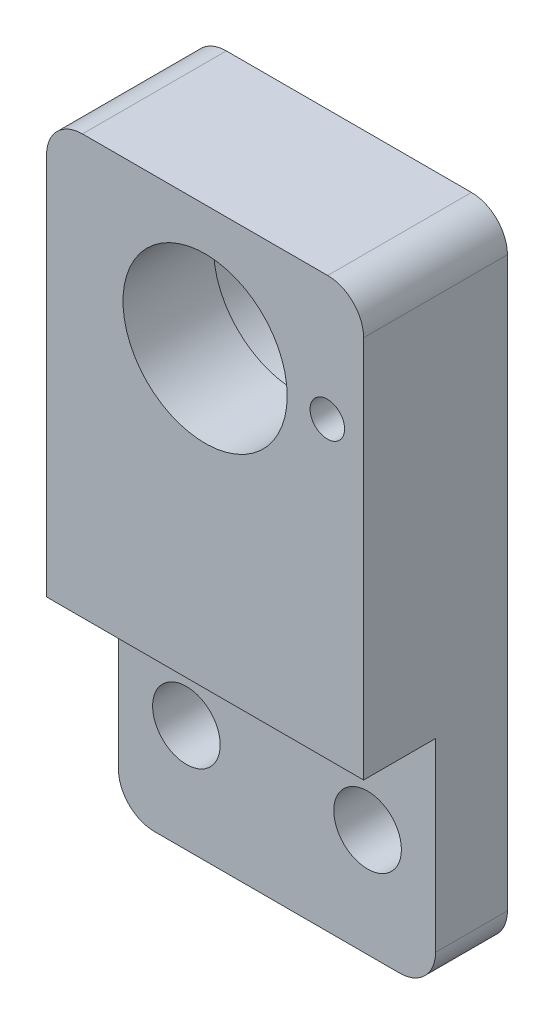
ISO-10303-21;
HEADER;
FILE_DESCRIPTION(('STEP AP214'),'2;1');
FILE_NAME('part.step','',(''),(''),'','','');
FILE_SCHEMA(('AUTOMOTIVE_DESIGN { 1 0 10303 214 1 1 1 1 }'));
ENDSEC;
DATA;
#1=APPLICATION_CONTEXT('core data for automotive mechanical design processes');
#2=APPLICATION_PROTOCOL_DEFINITION('international standard','automotive_design',2000,#1);
#3=PRODUCT_CONTEXT('',#1,'mechanical');
#4=PRODUCT('Part','Part','',(#3));
#5=PRODUCT_RELATED_PRODUCT_CATEGORY('part','',(#4));
#6=PRODUCT_DEFINITION_FORMATION('','',#4);
#7=PRODUCT_DEFINITION_CONTEXT('part definition',#1,'design');
#8=PRODUCT_DEFINITION('design','',#6,#7);
#9=PRODUCT_DEFINITION_SHAPE('','',#8);
#10=(LENGTH_UNIT() NAMED_UNIT(*) SI_UNIT(.MILLI.,.METRE.));
#11=(NAMED_UNIT(*) PLANE_ANGLE_UNIT() SI_UNIT($,.RADIAN.));
#12=(NAMED_UNIT(*) SI_UNIT($,.STERADIAN.) SOLID_ANGLE_UNIT());
#13=UNCERTAINTY_MEASURE_WITH_UNIT(LENGTH_MEASURE(1.E-05),#10,'distance_accuracy_value','');
#14=(GEOMETRIC_REPRESENTATION_CONTEXT(3) GLOBAL_UNCERTAINTY_ASSIGNED_CONTEXT((#13)) GLOBAL_UNIT_ASSIGNED_CONTEXT((#10,
#11,#12)) REPRESENTATION_CONTEXT('',''));
#15=CARTESIAN_POINT('',(0.,0.,0.));
#16=DIRECTION('',(0.,0.,1.));
#17=DIRECTION('',(1.,0.,0.));
#18=AXIS2_PLACEMENT_3D('',#15,#16,#17);
#19=CARTESIAN_POINT('',(125.3679604269,43.2406230543916,12.7));
#20=DIRECTION('',(-1.,0.,0.));
#21=DIRECTION('',(0.,0.,1.));
#22=AXIS2_PLACEMENT_3D('',#19,#20,#21);
#23=PLANE('',#22);
#24=DIRECTION('',(0.,1.,0.));
#25=VECTOR('',#24,1.);
#26=CARTESIAN_POINT('',(125.3679604269,43.2406230543916,6.35));
#27=LINE('',#26,#25);
#28=CARTESIAN_POINT('',(125.3679604269,67.36020405758,6.35));
#29=VERTEX_POINT('',#28);
#30=CARTESIAN_POINT('',(125.3679604269,83.71528405754,6.35));
#31=VERTEX_POINT('',#30);
#32=EDGE_CURVE('E230',#29,#31,#27,.T.);
#33=ORIENTED_EDGE('',*,*,#32,.T.);
#34=DIRECTION('',(0.,0.,1.));
#35=VECTOR('',#34,1.);
#36=CARTESIAN_POINT('',(125.3679604269,83.71528405754,6.35));
#37=LINE('',#36,#35);
#38=CARTESIAN_POINT('',(125.3679604269,83.71528405754,12.7));
#39=VERTEX_POINT('',#38);
#40=EDGE_CURVE('E219',#31,#39,#37,.T.);
#41=ORIENTED_EDGE('',*,*,#40,.T.);
#42=DIRECTION('',(0.,1.,0.));
#43=VECTOR('',#42,1.);
#44=CARTESIAN_POINT('',(125.3679604269,43.2406230543916,12.7));
#45=LINE('',#44,#43);
#46=CARTESIAN_POINT('',(125.3679604269,117.5402840579,12.7));
#47=VERTEX_POINT('',#46);
#48=EDGE_CURVE('E160',#39,#47,#45,.T.);
#49=ORIENTED_EDGE('',*,*,#48,.T.);
#50=DIRECTION('',(0.,0.,-1.));
#51=VECTOR('',#50,1.);
#52=CARTESIAN_POINT('',(125.3679604269,117.5402840579,12.7));
#53=LINE('',#52,#51);
#54=CARTESIAN_POINT('',(125.3679604269,117.5402840579,0.));
#55=VERTEX_POINT('',#54);
#56=EDGE_CURVE('E39',#47,#55,#53,.T.);
#57=ORIENTED_EDGE('',*,*,#56,.T.);
#58=DIRECTION('',(0.,1.,0.));
#59=VECTOR('',#58,1.);
#60=CARTESIAN_POINT('',(125.3679604269,43.2406230543916,0.));
#61=LINE('',#60,#59);
#62=CARTESIAN_POINT('',(125.3679604269,67.36020405758,0.));
#63=VERTEX_POINT('',#62);
#64=EDGE_CURVE('E157',#63,#55,#61,.T.);
#65=ORIENTED_EDGE('',*,*,#64,.F.);
#66=DIRECTION('',(0.,0.,-1.));
#67=VECTOR('',#66,1.);
#68=CARTESIAN_POINT('',(125.3679604269,67.36020405758,12.7));
#69=LINE('',#68,#67);
#70=EDGE_CURVE('E145',#29,#63,#69,.T.);
#71=ORIENTED_EDGE('',*,*,#70,.F.);
#72=EDGE_LOOP('',(#33,#41,#49,#57,#65,#71));
#73=FACE_BOUND('',#72,.T.);
#74=ADVANCED_FACE('F31',(#73),#23,.T.);
#75=CARTESIAN_POINT('',(128.5429604269,67.36020405758,12.7));
#76=DIRECTION('',(0.,0.,-1.));
#77=DIRECTION('',(-1.,0.,0.));
#78=AXIS2_PLACEMENT_3D('',#75,#76,#77);
#79=CYLINDRICAL_SURFACE('',#78,3.17500000000001);
#80=CARTESIAN_POINT('',(128.5429604269,67.36020405758,6.35));
#81=DIRECTION('',(0.,0.,1.));
#82=DIRECTION('',(1.,0.,0.));
#83=AXIS2_PLACEMENT_3D('',#80,#81,#82);
#84=CIRCLE('',#83,3.17500000000001);
#85=CARTESIAN_POINT('',(128.5429604269,64.18520405758,6.35));
#86=VERTEX_POINT('',#85);
#87=EDGE_CURVE('E124',#29,#86,#84,.T.);
#88=ORIENTED_EDGE('',*,*,#87,.F.);
#89=ORIENTED_EDGE('',*,*,#70,.T.);
#90=CARTESIAN_POINT('',(128.5429604269,67.36020405758,0.));
#91=DIRECTION('',(0.,0.,1.));
#92=DIRECTION('',(1.,0.,0.));
#93=AXIS2_PLACEMENT_3D('',#90,#91,#92);
#94=CIRCLE('',#93,3.17500000000001);
#95=CARTESIAN_POINT('',(128.5429604269,64.18520405758,0.));
#96=VERTEX_POINT('',#95);
#97=EDGE_CURVE('E173',#63,#96,#94,.T.);
#98=ORIENTED_EDGE('',*,*,#97,.T.);
#99=DIRECTION('',(0.,0.,-1.));
#100=VECTOR('',#99,1.);
#101=CARTESIAN_POINT('',(128.5429604269,64.18520405758,12.7));
#102=LINE('',#101,#100);
#103=EDGE_CURVE('E143',#86,#96,#102,.T.);
#104=ORIENTED_EDGE('',*,*,#103,.F.);
#105=EDGE_LOOP('',(#88,#89,#98,#104));
#106=FACE_BOUND('',#105,.T.);
#107=ADVANCED_FACE('F264',(#106),#79,.T.);
#108=CARTESIAN_POINT('',(139.36796042659,64.18520405758,12.7));
#109=DIRECTION('',(0.,1.,0.));
#110=DIRECTION('',(0.,0.,1.));
#111=AXIS2_PLACEMENT_3D('',#108,#109,#110);
#112=PLANE('',#111);
#113=DIRECTION('',(1.,0.,0.));
#114=VECTOR('',#113,1.);
#115=CARTESIAN_POINT('',(139.36796042659,64.18520405758,6.35));
#116=LINE('',#115,#114);
#117=CARTESIAN_POINT('',(150.19296042628,64.18520405758,6.35));
#118=VERTEX_POINT('',#117);
#119=EDGE_CURVE('E117',#86,#118,#116,.T.);
#120=ORIENTED_EDGE('',*,*,#119,.F.);
#121=ORIENTED_EDGE('',*,*,#103,.T.);
#122=DIRECTION('',(1.,0.,0.));
#123=VECTOR('',#122,1.);
#124=CARTESIAN_POINT('',(139.36796042659,64.18520405758,0.));
#125=LINE('',#124,#123);
#126=CARTESIAN_POINT('',(150.19296042628,64.18520405758,0.));
#127=VERTEX_POINT('',#126);
#128=EDGE_CURVE('E141',#96,#127,#125,.T.);
#129=ORIENTED_EDGE('',*,*,#128,.T.);
#130=DIRECTION('',(0.,0.,-1.));
#131=VECTOR('',#130,1.);
#132=CARTESIAN_POINT('',(150.19296042628,64.18520405758,12.7));
#133=LINE('',#132,#131);
#134=EDGE_CURVE('E134',#118,#127,#133,.T.);
#135=ORIENTED_EDGE('',*,*,#134,.F.);
#136=EDGE_LOOP('',(#120,#121,#129,#135));
#137=FACE_BOUND('',#136,.T.);
#138=ADVANCED_FACE('F139',(#137),#112,.F.);
#139=CARTESIAN_POINT('',(150.19296042628,67.36020405758,12.7));
#140=DIRECTION('',(0.,0.,-1.));
#141=DIRECTION('',(-1.,0.,0.));
#142=AXIS2_PLACEMENT_3D('',#139,#140,#141);
#143=CYLINDRICAL_SURFACE('',#142,3.17500000000001);
#144=CARTESIAN_POINT('',(150.19296042628,67.36020405758,6.35));
#145=DIRECTION('',(0.,0.,1.));
#146=DIRECTION('',(1.,0.,0.));
#147=AXIS2_PLACEMENT_3D('',#144,#145,#146);
#148=CIRCLE('',#147,3.17500000000001);
#149=CARTESIAN_POINT('',(153.36796042628,67.36020405758,6.35));
#150=VERTEX_POINT('',#149);
#151=EDGE_CURVE('E121',#118,#150,#148,.T.);
#152=ORIENTED_EDGE('',*,*,#151,.F.);
#153=ORIENTED_EDGE('',*,*,#134,.T.);
#154=CARTESIAN_POINT('',(150.19296042628,67.36020405758,0.));
#155=DIRECTION('',(0.,0.,1.));
#156=DIRECTION('',(1.,0.,0.));
#157=AXIS2_PLACEMENT_3D('',#154,#155,#156);
#158=CIRCLE('',#157,3.17500000000001);
#159=CARTESIAN_POINT('',(153.36796042628,67.36020405758,0.));
#160=VERTEX_POINT('',#159);
#161=EDGE_CURVE('E179',#127,#160,#158,.T.);
#162=ORIENTED_EDGE('',*,*,#161,.T.);
#163=DIRECTION('',(0.,0.,-1.));
#164=VECTOR('',#163,1.);
#165=CARTESIAN_POINT('',(153.36796042628,67.36020405758,12.7));
#166=LINE('',#165,#164);
#167=EDGE_CURVE('E136',#150,#160,#166,.T.);
#168=ORIENTED_EDGE('',*,*,#167,.F.);
#169=EDGE_LOOP('',(#152,#153,#162,#168));
#170=FACE_BOUND('',#169,.T.);
#171=ADVANCED_FACE('F132',(#170),#143,.T.);
#172=CARTESIAN_POINT('',(153.36796042628,43.2406230543916,12.7));
#173=DIRECTION('',(-1.,0.,0.));
#174=DIRECTION('',(0.,0.,1.));
#175=AXIS2_PLACEMENT_3D('',#172,#173,#174);
#176=PLANE('',#175);
#177=DIRECTION('',(0.,0.,1.));
#178=VECTOR('',#177,1.);
#179=CARTESIAN_POINT('',(153.36796042628,83.71528405754,6.35));
#180=LINE('',#179,#178);
#181=CARTESIAN_POINT('',(153.36796042628,83.71528405754,6.35));
#182=VERTEX_POINT('',#181);
#183=CARTESIAN_POINT('',(153.36796042628,83.71528405754,12.7));
#184=VERTEX_POINT('',#183);
#185=EDGE_CURVE('E46',#182,#184,#180,.T.);
#186=ORIENTED_EDGE('',*,*,#185,.F.);
#187=DIRECTION('',(0.,1.,0.));
#188=VECTOR('',#187,1.);
#189=CARTESIAN_POINT('',(153.36796042628,43.2406230543916,6.35));
#190=LINE('',#189,#188);
#191=EDGE_CURVE('E137',#150,#182,#190,.T.);
#192=ORIENTED_EDGE('',*,*,#191,.F.);
#193=ORIENTED_EDGE('',*,*,#167,.T.);
#194=DIRECTION('',(0.,1.,0.));
#195=VECTOR('',#194,1.);
#196=CARTESIAN_POINT('',(153.36796042628,43.2406230543916,0.));
#197=LINE('',#196,#195);
#198=CARTESIAN_POINT('',(153.36796042628,117.5402840579,0.));
#199=VERTEX_POINT('',#198);
#200=EDGE_CURVE('E181',#160,#199,#197,.T.);
#201=ORIENTED_EDGE('',*,*,#200,.T.);
#202=DIRECTION('',(0.,0.,-1.));
#203=VECTOR('',#202,1.);
#204=CARTESIAN_POINT('',(153.36796042628,117.5402840579,12.7));
#205=LINE('',#204,#203);
#206=CARTESIAN_POINT('',(153.36796042628,117.5402840579,12.7));
#207=VERTEX_POINT('',#206);
#208=EDGE_CURVE('E147',#207,#199,#205,.T.);
#209=ORIENTED_EDGE('',*,*,#208,.F.);
#210=DIRECTION('',(0.,1.,0.));
#211=VECTOR('',#210,1.);
#212=CARTESIAN_POINT('',(153.36796042628,43.2406230543916,12.7));
#213=LINE('',#212,#211);
#214=EDGE_CURVE('E207',#184,#207,#213,.T.);
#215=ORIENTED_EDGE('',*,*,#214,.F.);
#216=EDGE_LOOP('',(#186,#192,#193,#201,#209,#215));
#217=FACE_BOUND('',#216,.T.);
#218=ADVANCED_FACE('F250',(#217),#176,.F.);
#219=CARTESIAN_POINT('',(131.36796042586,73.71528405758,12.7));
#220=DIRECTION('',(0.,0.,-1.));
#221=DIRECTION('',(-1.,0.,0.));
#222=AXIS2_PLACEMENT_3D('',#219,#220,#221);
#223=CYLINDRICAL_SURFACE('',#222,2.9845);
#224=CARTESIAN_POINT('',(131.36796042586,73.71528405758,0.));
#225=DIRECTION('',(0.,0.,1.));
#226=DIRECTION('',(1.,0.,0.));
#227=AXIS2_PLACEMENT_3D('',#224,#225,#226);
#228=CIRCLE('',#227,2.9845);
#229=CARTESIAN_POINT('',(134.35246042586,73.71528405758,0.));
#230=VERTEX_POINT('',#229);
#231=EDGE_CURVE('E187',#230,#230,#228,.T.);
#232=ORIENTED_EDGE('',*,*,#231,.F.);
#233=EDGE_LOOP('',(#232));
#234=FACE_BOUND('',#233,.T.);
#235=CARTESIAN_POINT('',(131.36796042586,73.71528405758,6.35));
#236=DIRECTION('',(0.,0.,1.));
#237=DIRECTION('',(1.,0.,0.));
#238=AXIS2_PLACEMENT_3D('',#235,#236,#237);
#239=CIRCLE('',#238,2.9845);
#240=CARTESIAN_POINT('',(134.35246042586,73.71528405758,6.35));
#241=VERTEX_POINT('',#240);
#242=EDGE_CURVE('E128',#241,#241,#239,.T.);
#243=ORIENTED_EDGE('',*,*,#242,.T.);
#244=EDGE_LOOP('',(#243));
#245=FACE_BOUND('',#244,.T.);
#246=ADVANCED_FACE('F248',(#234,#245),#223,.F.);
#247=CARTESIAN_POINT('',(147.36796042732,73.71528405758,12.7));
#248=DIRECTION('',(0.,0.,-1.));
#249=DIRECTION('',(-1.,0.,0.));
#250=AXIS2_PLACEMENT_3D('',#247,#248,#249);
#251=CYLINDRICAL_SURFACE('',#250,2.9845);
#252=CARTESIAN_POINT('',(147.36796042732,73.71528405758,0.));
#253=DIRECTION('',(0.,0.,1.));
#254=DIRECTION('',(1.,0.,0.));
#255=AXIS2_PLACEMENT_3D('',#252,#253,#254);
#256=CIRCLE('',#255,2.9845);
#257=CARTESIAN_POINT('',(150.35246042732,73.71528405758,0.));
#258=VERTEX_POINT('',#257);
#259=EDGE_CURVE('E184',#258,#258,#256,.T.);
#260=ORIENTED_EDGE('',*,*,#259,.F.);
#261=EDGE_LOOP('',(#260));
#262=FACE_BOUND('',#261,.T.);
#263=CARTESIAN_POINT('',(147.36796042732,73.71528405758,6.35));
#264=DIRECTION('',(0.,0.,1.));
#265=DIRECTION('',(1.,0.,0.));
#266=AXIS2_PLACEMENT_3D('',#263,#264,#265);
#267=CIRCLE('',#266,2.9845);
#268=CARTESIAN_POINT('',(150.35246042732,73.71528405758,6.35));
#269=VERTEX_POINT('',#268);
#270=EDGE_CURVE('E228',#269,#269,#267,.T.);
#271=ORIENTED_EDGE('',*,*,#270,.T.);
#272=EDGE_LOOP('',(#271));
#273=FACE_BOUND('',#272,.T.);
#274=ADVANCED_FACE('F240',(#262,#273),#251,.F.);
#275=CARTESIAN_POINT('',(139.36796042659,43.2406230543916,12.7));
#276=DIRECTION('',(0.,0.,1.));
#277=DIRECTION('',(1.,0.,0.));
#278=AXIS2_PLACEMENT_3D('',#275,#276,#277);
#279=PLANE('',#278);
#280=CARTESIAN_POINT('',(139.36796042786,109.71528405896,12.7));
#281=DIRECTION('',(0.,0.,1.));
#282=DIRECTION('',(1.,0.,0.));
#283=AXIS2_PLACEMENT_3D('',#280,#281,#282);
#284=CIRCLE('',#283,7.25000000085998);
#285=CARTESIAN_POINT('',(146.61796042872,109.71528405896,12.7));
#286=VERTEX_POINT('',#285);
#287=EDGE_CURVE('E192',#286,#286,#284,.T.);
#288=ORIENTED_EDGE('',*,*,#287,.F.);
#289=EDGE_LOOP('',(#288));
#290=FACE_BOUND('',#289,.T.);
#291=CARTESIAN_POINT('',(150.16296042786,109.71528405896,12.7));
#292=DIRECTION('',(0.,0.,1.));
#293=DIRECTION('',(1.,0.,0.));
#294=AXIS2_PLACEMENT_3D('',#291,#292,#293);
#295=CIRCLE('',#294,1.524);
#296=CARTESIAN_POINT('',(151.68696042786,109.71528405896,12.7));
#297=VERTEX_POINT('',#296);
#298=EDGE_CURVE('E190',#297,#297,#295,.T.);
#299=ORIENTED_EDGE('',*,*,#298,.F.);
#300=EDGE_LOOP('',(#299));
#301=FACE_BOUND('',#300,.T.);
#302=ORIENTED_EDGE('',*,*,#48,.F.);
#303=DIRECTION('',(1.,0.,0.));
#304=VECTOR('',#303,1.);
#305=CARTESIAN_POINT('',(139.36796042659,83.71528405754,12.7));
#306=LINE('',#305,#304);
#307=EDGE_CURVE('E226',#39,#184,#306,.T.);
#308=ORIENTED_EDGE('',*,*,#307,.T.);
#309=ORIENTED_EDGE('',*,*,#214,.T.);
#310=CARTESIAN_POINT('',(150.19296042628,117.5402840579,12.7));
#311=DIRECTION('',(0.,0.,1.));
#312=DIRECTION('',(1.,0.,0.));
#313=AXIS2_PLACEMENT_3D('',#310,#311,#312);
#314=CIRCLE('',#313,3.175);
#315=CARTESIAN_POINT('',(150.19296042628,120.7152840579,12.7));
#316=VERTEX_POINT('',#315);
#317=EDGE_CURVE('E55',#207,#316,#314,.T.);
#318=ORIENTED_EDGE('',*,*,#317,.T.);
#319=DIRECTION('',(-1.,0.,0.));
#320=VECTOR('',#319,1.);
#321=CARTESIAN_POINT('',(139.36796042659,120.7152840579,12.7));
#322=LINE('',#321,#320);
#323=CARTESIAN_POINT('',(128.5429604269,120.7152840579,12.7));
#324=VERTEX_POINT('',#323);
#325=EDGE_CURVE('E211',#316,#324,#322,.T.);
#326=ORIENTED_EDGE('',*,*,#325,.T.);
#327=CARTESIAN_POINT('',(128.5429604269,117.5402840579,12.7));
#328=DIRECTION('',(0.,0.,1.));
#329=DIRECTION('',(1.,0.,0.));
#330=AXIS2_PLACEMENT_3D('',#327,#328,#329);
#331=CIRCLE('',#330,3.175);
#332=EDGE_CURVE('E95',#324,#47,#331,.T.);
#333=ORIENTED_EDGE('',*,*,#332,.T.);
#334=EDGE_LOOP('',(#302,#308,#309,#318,#326,#333));
#335=FACE_BOUND('',#334,.T.);
#336=ADVANCED_FACE('F257',(#290,#301,#335),#279,.T.);
#337=CARTESIAN_POINT('',(139.36796042659,43.2406230543916,0.));
#338=DIRECTION('',(0.,0.,1.));
#339=DIRECTION('',(1.,0.,0.));
#340=AXIS2_PLACEMENT_3D('',#337,#338,#339);
#341=PLANE('',#340);
#342=ORIENTED_EDGE('',*,*,#231,.T.);
#343=EDGE_LOOP('',(#342));
#344=FACE_BOUND('',#343,.T.);
#345=ORIENTED_EDGE('',*,*,#259,.T.);
#346=EDGE_LOOP('',(#345));
#347=FACE_BOUND('',#346,.T.);
#348=DIRECTION('',(-1.,0.,0.));
#349=VECTOR('',#348,1.);
#350=CARTESIAN_POINT('',(139.36796042659,120.7152840579,0.));
#351=LINE('',#350,#349);
#352=CARTESIAN_POINT('',(150.19296042628,120.7152840579,0.));
#353=VERTEX_POINT('',#352);
#354=CARTESIAN_POINT('',(128.5429604269,120.7152840579,0.));
#355=VERTEX_POINT('',#354);
#356=EDGE_CURVE('E167',#353,#355,#351,.T.);
#357=ORIENTED_EDGE('',*,*,#356,.F.);
#358=CARTESIAN_POINT('',(150.19296042628,117.5402840579,0.));
#359=DIRECTION('',(0.,0.,1.));
#360=DIRECTION('',(1.,0.,0.));
#361=AXIS2_PLACEMENT_3D('',#358,#359,#360);
#362=CIRCLE('',#361,3.175);
#363=EDGE_CURVE('E88',#199,#353,#362,.T.);
#364=ORIENTED_EDGE('',*,*,#363,.F.);
#365=ORIENTED_EDGE('',*,*,#200,.F.);
#366=ORIENTED_EDGE('',*,*,#161,.F.);
#367=ORIENTED_EDGE('',*,*,#128,.F.);
#368=ORIENTED_EDGE('',*,*,#97,.F.);
#369=ORIENTED_EDGE('',*,*,#64,.T.);
#370=CARTESIAN_POINT('',(128.5429604269,117.5402840579,0.));
#371=DIRECTION('',(0.,0.,1.));
#372=DIRECTION('',(1.,0.,0.));
#373=AXIS2_PLACEMENT_3D('',#370,#371,#372);
#374=CIRCLE('',#373,3.175);
#375=EDGE_CURVE('E161',#355,#55,#374,.T.);
#376=ORIENTED_EDGE('',*,*,#375,.F.);
#377=EDGE_LOOP('',(#357,#364,#365,#366,#367,#368,#369,#376));
#378=FACE_BOUND('',#377,.T.);
#379=CARTESIAN_POINT('',(150.16296042786,109.71528405896,0.));
#380=DIRECTION('',(0.,0.,1.));
#381=DIRECTION('',(1.,0.,0.));
#382=AXIS2_PLACEMENT_3D('',#379,#380,#381);
#383=CIRCLE('',#382,1.524);
#384=CARTESIAN_POINT('',(151.68696042786,109.71528405896,0.));
#385=VERTEX_POINT('',#384);
#386=EDGE_CURVE('E199',#385,#385,#383,.T.);
#387=ORIENTED_EDGE('',*,*,#386,.T.);
#388=EDGE_LOOP('',(#387));
#389=FACE_BOUND('',#388,.T.);
#390=CARTESIAN_POINT('',(139.36796042786,109.71528405896,0.));
#391=DIRECTION('',(0.,0.,1.));
#392=DIRECTION('',(1.,0.,0.));
#393=AXIS2_PLACEMENT_3D('',#390,#391,#392);
#394=CIRCLE('',#393,7.95019999999999);
#395=CARTESIAN_POINT('',(147.31816042786,109.71528405896,0.));
#396=VERTEX_POINT('',#395);
#397=EDGE_CURVE('E215',#396,#396,#394,.T.);
#398=ORIENTED_EDGE('',*,*,#397,.T.);
#399=EDGE_LOOP('',(#398));
#400=FACE_BOUND('',#399,.T.);
#401=ADVANCED_FACE('F170',(#344,#347,#378,#389,#400),#341,.F.);
#402=CARTESIAN_POINT('',(139.36796042659,120.7152840579,12.7));
#403=DIRECTION('',(0.,-1.,0.));
#404=DIRECTION('',(0.,0.,-1.));
#405=AXIS2_PLACEMENT_3D('',#402,#403,#404);
#406=PLANE('',#405);
#407=ORIENTED_EDGE('',*,*,#356,.T.);
#408=DIRECTION('',(0.,0.,-1.));
#409=VECTOR('',#408,1.);
#410=CARTESIAN_POINT('',(128.5429604269,120.7152840579,12.7));
#411=LINE('',#410,#409);
#412=EDGE_CURVE('E11',#324,#355,#411,.T.);
#413=ORIENTED_EDGE('',*,*,#412,.F.);
#414=ORIENTED_EDGE('',*,*,#325,.F.);
#415=DIRECTION('',(0.,0.,-1.));
#416=VECTOR('',#415,1.);
#417=CARTESIAN_POINT('',(150.19296042628,120.7152840579,12.7));
#418=LINE('',#417,#416);
#419=EDGE_CURVE('E191',#316,#353,#418,.T.);
#420=ORIENTED_EDGE('',*,*,#419,.T.);
#421=EDGE_LOOP('',(#407,#413,#414,#420));
#422=FACE_BOUND('',#421,.T.);
#423=ADVANCED_FACE('F274',(#422),#406,.F.);
#424=CARTESIAN_POINT('',(128.5429604269,117.5402840579,12.7));
#425=DIRECTION('',(0.,0.,-1.));
#426=DIRECTION('',(-1.,0.,0.));
#427=AXIS2_PLACEMENT_3D('',#424,#425,#426);
#428=CYLINDRICAL_SURFACE('',#427,3.175);
#429=ORIENTED_EDGE('',*,*,#375,.T.);
#430=ORIENTED_EDGE('',*,*,#56,.F.);
#431=ORIENTED_EDGE('',*,*,#332,.F.);
#432=ORIENTED_EDGE('',*,*,#412,.T.);
#433=EDGE_LOOP('',(#429,#430,#431,#432));
#434=FACE_BOUND('',#433,.T.);
#435=ADVANCED_FACE('F162',(#434),#428,.T.);
#436=CARTESIAN_POINT('',(150.19296042628,117.5402840579,12.7));
#437=DIRECTION('',(0.,0.,-1.));
#438=DIRECTION('',(-1.,0.,0.));
#439=AXIS2_PLACEMENT_3D('',#436,#437,#438);
#440=CYLINDRICAL_SURFACE('',#439,3.175);
#441=ORIENTED_EDGE('',*,*,#363,.T.);
#442=ORIENTED_EDGE('',*,*,#419,.F.);
#443=ORIENTED_EDGE('',*,*,#317,.F.);
#444=ORIENTED_EDGE('',*,*,#208,.T.);
#445=EDGE_LOOP('',(#441,#442,#443,#444));
#446=FACE_BOUND('',#445,.T.);
#447=ADVANCED_FACE('F194',(#446),#440,.T.);
#448=CARTESIAN_POINT('',(150.16296042786,109.71528405896,12.7));
#449=DIRECTION('',(0.,0.,-1.));
#450=DIRECTION('',(-1.,0.,0.));
#451=AXIS2_PLACEMENT_3D('',#448,#449,#450);
#452=CYLINDRICAL_SURFACE('',#451,1.524);
#453=ORIENTED_EDGE('',*,*,#298,.T.);
#454=EDGE_LOOP('',(#453));
#455=FACE_BOUND('',#454,.T.);
#456=ORIENTED_EDGE('',*,*,#386,.F.);
#457=EDGE_LOOP('',(#456));
#458=FACE_BOUND('',#457,.T.);
#459=ADVANCED_FACE('F33',(#455,#458),#452,.F.);
#460=CARTESIAN_POINT('',(139.36796042786,109.71528405896,12.7));
#461=DIRECTION('',(0.,0.,-1.));
#462=DIRECTION('',(-1.,0.,0.));
#463=AXIS2_PLACEMENT_3D('',#460,#461,#462);
#464=CYLINDRICAL_SURFACE('',#463,7.25000000085998);
#465=CARTESIAN_POINT('',(139.36796042786,109.71528405896,4.699));
#466=DIRECTION('',(0.,0.,1.));
#467=DIRECTION('',(1.,0.,0.));
#468=AXIS2_PLACEMENT_3D('',#465,#466,#467);
#469=CIRCLE('',#468,7.25000000085998);
#470=CARTESIAN_POINT('',(146.61796042872,109.71528405896,4.699));
#471=VERTEX_POINT('',#470);
#472=EDGE_CURVE('E218',#471,#471,#469,.T.);
#473=ORIENTED_EDGE('',*,*,#472,.F.);
#474=EDGE_LOOP('',(#473));
#475=FACE_BOUND('',#474,.T.);
#476=ORIENTED_EDGE('',*,*,#287,.T.);
#477=EDGE_LOOP('',(#476));
#478=FACE_BOUND('',#477,.T.);
#479=ADVANCED_FACE('F288',(#475,#478),#464,.F.);
#480=CARTESIAN_POINT('',(139.36796042786,109.71528405896,4.699));
#481=DIRECTION('',(0.,0.,-1.));
#482=DIRECTION('',(-1.,0.,0.));
#483=AXIS2_PLACEMENT_3D('',#480,#481,#482);
#484=CYLINDRICAL_SURFACE('',#483,7.95019999999999);
#485=CARTESIAN_POINT('',(139.36796042786,109.71528405896,4.699));
#486=DIRECTION('',(0.,0.,1.));
#487=DIRECTION('',(1.,0.,0.));
#488=AXIS2_PLACEMENT_3D('',#485,#486,#487);
#489=CIRCLE('',#488,7.95019999999999);
#490=CARTESIAN_POINT('',(147.31816042786,109.71528405896,4.699));
#491=VERTEX_POINT('',#490);
#492=EDGE_CURVE('E201',#491,#491,#489,.T.);
#493=ORIENTED_EDGE('',*,*,#492,.T.);
#494=EDGE_LOOP('',(#493));
#495=FACE_BOUND('',#494,.T.);
#496=ORIENTED_EDGE('',*,*,#397,.F.);
#497=EDGE_LOOP('',(#496));
#498=FACE_BOUND('',#497,.T.);
#499=ADVANCED_FACE('F290',(#495,#498),#484,.F.);
#500=CARTESIAN_POINT('',(139.36796042659,43.2406230543916,4.699));
#501=DIRECTION('',(0.,0.,1.));
#502=DIRECTION('',(1.,0.,0.));
#503=AXIS2_PLACEMENT_3D('',#500,#501,#502);
#504=PLANE('',#503);
#505=ORIENTED_EDGE('',*,*,#472,.T.);
#506=EDGE_LOOP('',(#505));
#507=FACE_BOUND('',#506,.T.);
#508=ORIENTED_EDGE('',*,*,#492,.F.);
#509=EDGE_LOOP('',(#508));
#510=FACE_BOUND('',#509,.T.);
#511=ADVANCED_FACE('F296',(#507,#510),#504,.F.);
#512=CARTESIAN_POINT('',(139.36796042659,83.71528405754,6.35));
#513=DIRECTION('',(0.,-1.,0.));
#514=DIRECTION('',(0.,0.,-1.));
#515=AXIS2_PLACEMENT_3D('',#512,#513,#514);
#516=PLANE('',#515);
#517=ORIENTED_EDGE('',*,*,#307,.F.);
#518=ORIENTED_EDGE('',*,*,#40,.F.);
#519=DIRECTION('',(1.,0.,0.));
#520=VECTOR('',#519,1.);
#521=CARTESIAN_POINT('',(139.36796042659,83.71528405754,6.35));
#522=LINE('',#521,#520);
#523=EDGE_CURVE('E232',#31,#182,#522,.T.);
#524=ORIENTED_EDGE('',*,*,#523,.T.);
#525=ORIENTED_EDGE('',*,*,#185,.T.);
#526=EDGE_LOOP('',(#517,#518,#524,#525));
#527=FACE_BOUND('',#526,.T.);
#528=ADVANCED_FACE('F244',(#527),#516,.T.);
#529=CARTESIAN_POINT('',(139.36796042659,43.2406230543916,6.35));
#530=DIRECTION('',(0.,0.,1.));
#531=DIRECTION('',(1.,0.,0.));
#532=AXIS2_PLACEMENT_3D('',#529,#530,#531);
#533=PLANE('',#532);
#534=ORIENTED_EDGE('',*,*,#270,.F.);
#535=EDGE_LOOP('',(#534));
#536=FACE_BOUND('',#535,.T.);
#537=ORIENTED_EDGE('',*,*,#242,.F.);
#538=EDGE_LOOP('',(#537));
#539=FACE_BOUND('',#538,.T.);
#540=ORIENTED_EDGE('',*,*,#119,.T.);
#541=ORIENTED_EDGE('',*,*,#151,.T.);
#542=ORIENTED_EDGE('',*,*,#191,.T.);
#543=ORIENTED_EDGE('',*,*,#523,.F.);
#544=ORIENTED_EDGE('',*,*,#32,.F.);
#545=ORIENTED_EDGE('',*,*,#87,.T.);
#546=EDGE_LOOP('',(#540,#541,#542,#543,#544,#545));
#547=FACE_BOUND('',#546,.T.);
#548=ADVANCED_FACE('F119',(#536,#539,#547),#533,.T.);
#549=CLOSED_SHELL('',(#74,#107,#138,#171,#218,#246,#274,#336,#401,#423,#435,#447,#459,#479,#499,
#511,#528,#548));
#550=MANIFOLD_SOLID_BREP('B2',#549);
#551=ADVANCED_BREP_SHAPE_REPRESENTATION('',(#18,#550),#14);
#552=SHAPE_DEFINITION_REPRESENTATION(#9,#551);
ENDSEC;
END-ISO-10303-21;
